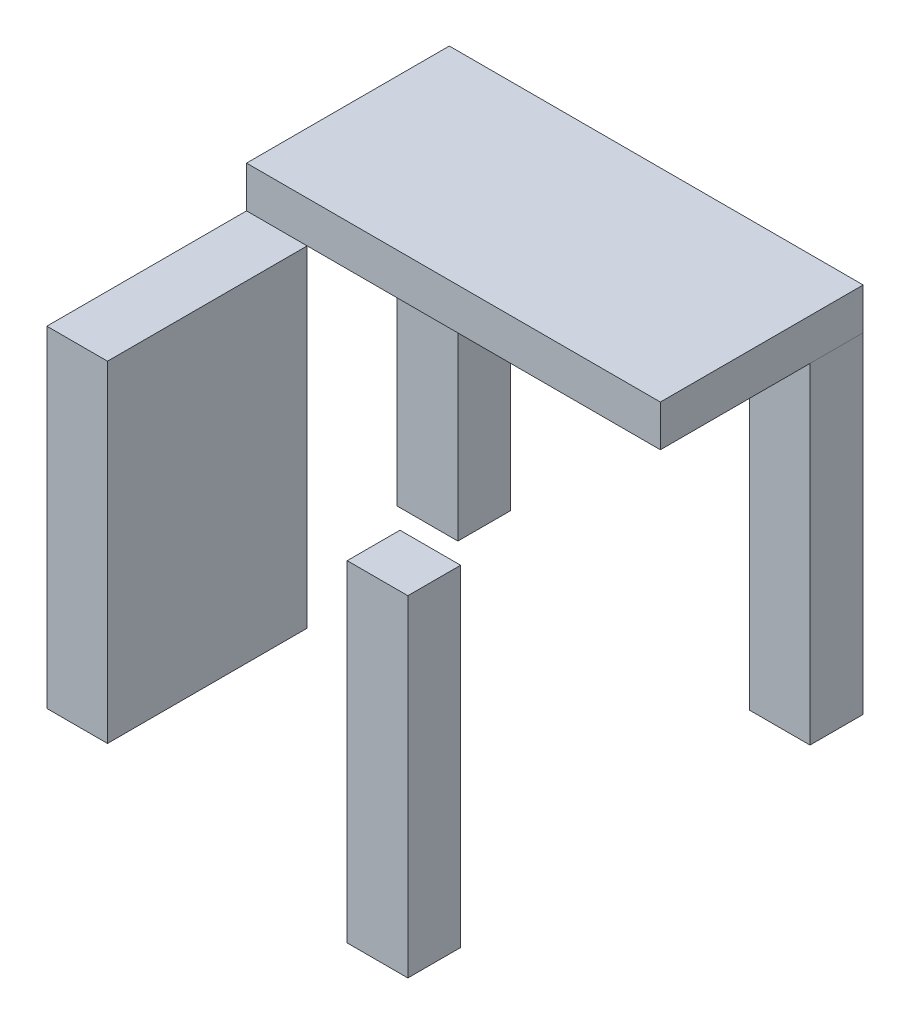
ISO-10303-21;
HEADER;
FILE_DESCRIPTION(('STEP AP214'),'2;1');
FILE_NAME('part.step','',(''),(''),'','','');
FILE_SCHEMA(('AUTOMOTIVE_DESIGN { 1 0 10303 214 1 1 1 1 }'));
ENDSEC;
DATA;
#1=APPLICATION_CONTEXT('core data for automotive mechanical design processes');
#2=APPLICATION_PROTOCOL_DEFINITION('international standard','automotive_design',2000,#1);
#3=PRODUCT_CONTEXT('',#1,'mechanical');
#4=PRODUCT('Part','Part','',(#3));
#5=PRODUCT_RELATED_PRODUCT_CATEGORY('part','',(#4));
#6=PRODUCT_DEFINITION_FORMATION('','',#4);
#7=PRODUCT_DEFINITION_CONTEXT('part definition',#1,'design');
#8=PRODUCT_DEFINITION('design','',#6,#7);
#9=PRODUCT_DEFINITION_SHAPE('','',#8);
#10=(LENGTH_UNIT() NAMED_UNIT(*) SI_UNIT(.MILLI.,.METRE.));
#11=(NAMED_UNIT(*) PLANE_ANGLE_UNIT() SI_UNIT($,.RADIAN.));
#12=(NAMED_UNIT(*) SI_UNIT($,.STERADIAN.) SOLID_ANGLE_UNIT());
#13=UNCERTAINTY_MEASURE_WITH_UNIT(LENGTH_MEASURE(1.E-05),#10,'distance_accuracy_value','');
#14=(GEOMETRIC_REPRESENTATION_CONTEXT(3) GLOBAL_UNCERTAINTY_ASSIGNED_CONTEXT((#13)) GLOBAL_UNIT_ASSIGNED_CONTEXT((#10,
#11,#12)) REPRESENTATION_CONTEXT('',''));
#15=CARTESIAN_POINT('',(0.,0.,0.));
#16=DIRECTION('',(0.,0.,1.));
#17=DIRECTION('',(1.,0.,0.));
#18=AXIS2_PLACEMENT_3D('',#15,#16,#17);
#19=CARTESIAN_POINT('',(85.36181093433,-80.,110.034688240795));
#20=DIRECTION('',(1.,0.,0.));
#21=DIRECTION('',(0.,0.,-1.));
#22=AXIS2_PLACEMENT_3D('',#19,#20,#21);
#23=PLANE('',#22);
#24=DIRECTION('',(0.,0.,-1.));
#25=VECTOR('',#24,1.);
#26=CARTESIAN_POINT('',(85.36181093433,0.,110.034688240795));
#27=LINE('',#26,#25);
#28=CARTESIAN_POINT('',(85.36181093433,0.,110.034688240795));
#29=VERTEX_POINT('',#28);
#30=CARTESIAN_POINT('',(85.36181093433,0.,97.2842820171065));
#31=VERTEX_POINT('',#30);
#32=EDGE_CURVE('E107',#29,#31,#27,.T.);
#33=ORIENTED_EDGE('',*,*,#32,.T.);
#34=DIRECTION('',(0.,1.,0.));
#35=VECTOR('',#34,1.);
#36=CARTESIAN_POINT('',(85.36181093433,-80.,97.2842820171065));
#37=LINE('',#36,#35);
#38=CARTESIAN_POINT('',(85.36181093433,-80.,97.2842820171065));
#39=VERTEX_POINT('',#38);
#40=EDGE_CURVE('E12',#39,#31,#37,.T.);
#41=ORIENTED_EDGE('',*,*,#40,.F.);
#42=DIRECTION('',(0.,0.,-1.));
#43=VECTOR('',#42,1.);
#44=CARTESIAN_POINT('',(85.36181093433,-80.,110.034688240795));
#45=LINE('',#44,#43);
#46=CARTESIAN_POINT('',(85.36181093433,-80.,110.034688240795));
#47=VERTEX_POINT('',#46);
#48=EDGE_CURVE('E95',#47,#39,#45,.T.);
#49=ORIENTED_EDGE('',*,*,#48,.F.);
#50=DIRECTION('',(0.,1.,0.));
#51=VECTOR('',#50,1.);
#52=CARTESIAN_POINT('',(85.36181093433,-80.,110.034688240795));
#53=LINE('',#52,#51);
#54=EDGE_CURVE('E103',#47,#29,#53,.T.);
#55=ORIENTED_EDGE('',*,*,#54,.T.);
#56=EDGE_LOOP('',(#33,#41,#49,#55));
#57=FACE_BOUND('',#56,.T.);
#58=ADVANCED_FACE('F44',(#57),#23,.F.);
#59=CARTESIAN_POINT('',(85.36181093433,-80.,97.2842820171065));
#60=DIRECTION('',(0.,0.,1.));
#61=DIRECTION('',(1.,0.,0.));
#62=AXIS2_PLACEMENT_3D('',#59,#60,#61);
#63=PLANE('',#62);
#64=DIRECTION('',(1.,0.,0.));
#65=VECTOR('',#64,1.);
#66=CARTESIAN_POINT('',(85.36181093433,0.,97.2842820171065));
#67=LINE('',#66,#65);
#68=CARTESIAN_POINT('',(100.019107271016,0.,97.2842820171065));
#69=VERTEX_POINT('',#68);
#70=EDGE_CURVE('E99',#31,#69,#67,.T.);
#71=ORIENTED_EDGE('',*,*,#70,.T.);
#72=DIRECTION('',(0.,1.,0.));
#73=VECTOR('',#72,1.);
#74=CARTESIAN_POINT('',(100.019107271016,-80.,97.2842820171065));
#75=LINE('',#74,#73);
#76=CARTESIAN_POINT('',(100.019107271016,-80.,97.2842820171065));
#77=VERTEX_POINT('',#76);
#78=EDGE_CURVE('E52',#77,#69,#75,.T.);
#79=ORIENTED_EDGE('',*,*,#78,.F.);
#80=DIRECTION('',(1.,0.,0.));
#81=VECTOR('',#80,1.);
#82=CARTESIAN_POINT('',(85.36181093433,-80.,97.2842820171065));
#83=LINE('',#82,#81);
#84=EDGE_CURVE('E90',#39,#77,#83,.T.);
#85=ORIENTED_EDGE('',*,*,#84,.F.);
#86=ORIENTED_EDGE('',*,*,#40,.T.);
#87=EDGE_LOOP('',(#71,#79,#85,#86));
#88=FACE_BOUND('',#87,.T.);
#89=ADVANCED_FACE('F98',(#88),#63,.F.);
#90=CARTESIAN_POINT('',(100.019107271016,-80.,110.034688240795));
#91=DIRECTION('',(-1.,0.,0.));
#92=DIRECTION('',(0.,0.,1.));
#93=AXIS2_PLACEMENT_3D('',#90,#91,#92);
#94=PLANE('',#93);
#95=DIRECTION('',(0.,0.,1.));
#96=VECTOR('',#95,1.);
#97=CARTESIAN_POINT('',(100.019107271016,0.,110.034688240795));
#98=LINE('',#97,#96);
#99=CARTESIAN_POINT('',(100.019107271016,0.,110.034688240795));
#100=VERTEX_POINT('',#99);
#101=EDGE_CURVE('E77',#69,#100,#98,.T.);
#102=ORIENTED_EDGE('',*,*,#101,.T.);
#103=DIRECTION('',(0.,1.,0.));
#104=VECTOR('',#103,1.);
#105=CARTESIAN_POINT('',(100.019107271016,-80.,110.034688240795));
#106=LINE('',#105,#104);
#107=CARTESIAN_POINT('',(100.019107271016,-80.,110.034688240795));
#108=VERTEX_POINT('',#107);
#109=EDGE_CURVE('E100',#108,#100,#106,.T.);
#110=ORIENTED_EDGE('',*,*,#109,.F.);
#111=DIRECTION('',(0.,0.,1.));
#112=VECTOR('',#111,1.);
#113=CARTESIAN_POINT('',(100.019107271016,-80.,110.034688240795));
#114=LINE('',#113,#112);
#115=EDGE_CURVE('E93',#77,#108,#114,.T.);
#116=ORIENTED_EDGE('',*,*,#115,.F.);
#117=ORIENTED_EDGE('',*,*,#78,.T.);
#118=EDGE_LOOP('',(#102,#110,#116,#117));
#119=FACE_BOUND('',#118,.T.);
#120=ADVANCED_FACE('F101',(#119),#94,.F.);
#121=CARTESIAN_POINT('',(85.36181093433,-80.,110.034688240795));
#122=DIRECTION('',(0.,0.,-1.));
#123=DIRECTION('',(-1.,0.,0.));
#124=AXIS2_PLACEMENT_3D('',#121,#122,#123);
#125=PLANE('',#124);
#126=DIRECTION('',(-1.,0.,0.));
#127=VECTOR('',#126,1.);
#128=CARTESIAN_POINT('',(85.36181093433,0.,110.034688240795));
#129=LINE('',#128,#127);
#130=EDGE_CURVE('E83',#100,#29,#129,.T.);
#131=ORIENTED_EDGE('',*,*,#130,.T.);
#132=ORIENTED_EDGE('',*,*,#54,.F.);
#133=DIRECTION('',(-1.,0.,0.));
#134=VECTOR('',#133,1.);
#135=CARTESIAN_POINT('',(85.36181093433,-80.,110.034688240795));
#136=LINE('',#135,#134);
#137=EDGE_CURVE('E60',#108,#47,#136,.T.);
#138=ORIENTED_EDGE('',*,*,#137,.F.);
#139=ORIENTED_EDGE('',*,*,#109,.T.);
#140=EDGE_LOOP('',(#131,#132,#138,#139));
#141=FACE_BOUND('',#140,.T.);
#142=ADVANCED_FACE('F114',(#141),#125,.F.);
#143=CARTESIAN_POINT('',(0.,-80.,0.));
#144=DIRECTION('',(0.,-1.,0.));
#145=DIRECTION('',(0.,0.,-1.));
#146=AXIS2_PLACEMENT_3D('',#143,#144,#145);
#147=PLANE('',#146);
#148=ORIENTED_EDGE('',*,*,#48,.T.);
#149=ORIENTED_EDGE('',*,*,#84,.T.);
#150=ORIENTED_EDGE('',*,*,#115,.T.);
#151=ORIENTED_EDGE('',*,*,#137,.T.);
#152=EDGE_LOOP('',(#148,#149,#150,#151));
#153=FACE_BOUND('',#152,.T.);
#154=ADVANCED_FACE('F91',(#153),#147,.T.);
#155=CARTESIAN_POINT('',(0.,0.,0.));
#156=DIRECTION('',(0.,-1.,0.));
#157=DIRECTION('',(0.,0.,-1.));
#158=AXIS2_PLACEMENT_3D('',#155,#156,#157);
#159=PLANE('',#158);
#160=ORIENTED_EDGE('',*,*,#32,.F.);
#161=ORIENTED_EDGE('',*,*,#130,.F.);
#162=ORIENTED_EDGE('',*,*,#101,.F.);
#163=ORIENTED_EDGE('',*,*,#70,.F.);
#164=EDGE_LOOP('',(#160,#161,#162,#163));
#165=FACE_BOUND('',#164,.T.);
#166=ADVANCED_FACE('F117',(#165),#159,.F.);
#167=CLOSED_SHELL('',(#58,#89,#120,#142,#154,#166));
#168=MANIFOLD_SOLID_BREP('B2',#167);
#169=CARTESIAN_POINT('',(0.,-80.,49.));
#170=DIRECTION('',(1.,0.,0.));
#171=DIRECTION('',(0.,0.,-1.));
#172=AXIS2_PLACEMENT_3D('',#169,#170,#171);
#173=PLANE('',#172);
#174=DIRECTION('',(0.,0.,-1.));
#175=VECTOR('',#174,1.);
#176=CARTESIAN_POINT('',(0.,0.,49.));
#177=LINE('',#176,#175);
#178=CARTESIAN_POINT('',(0.,0.,97.2495937763114));
#179=VERTEX_POINT('',#178);
#180=CARTESIAN_POINT('',(0.,0.,49.));
#181=VERTEX_POINT('',#180);
#182=EDGE_CURVE('E240',#179,#181,#177,.T.);
#183=ORIENTED_EDGE('',*,*,#182,.T.);
#184=DIRECTION('',(0.,1.,0.));
#185=VECTOR('',#184,1.);
#186=CARTESIAN_POINT('',(0.,-80.,49.));
#187=LINE('',#186,#185);
#188=CARTESIAN_POINT('',(0.,-80.,49.));
#189=VERTEX_POINT('',#188);
#190=EDGE_CURVE('E42',#189,#181,#187,.T.);
#191=ORIENTED_EDGE('',*,*,#190,.F.);
#192=DIRECTION('',(0.,0.,-1.));
#193=VECTOR('',#192,1.);
#194=CARTESIAN_POINT('',(0.,-80.,49.));
#195=LINE('',#194,#193);
#196=CARTESIAN_POINT('',(0.,-80.,97.2495937763114));
#197=VERTEX_POINT('',#196);
#198=EDGE_CURVE('E228',#197,#189,#195,.T.);
#199=ORIENTED_EDGE('',*,*,#198,.F.);
#200=DIRECTION('',(0.,1.,0.));
#201=VECTOR('',#200,1.);
#202=CARTESIAN_POINT('',(0.,-80.,97.2495937763114));
#203=LINE('',#202,#201);
#204=EDGE_CURVE('E236',#197,#179,#203,.T.);
#205=ORIENTED_EDGE('',*,*,#204,.T.);
#206=EDGE_LOOP('',(#183,#191,#199,#205));
#207=FACE_BOUND('',#206,.T.);
#208=ADVANCED_FACE('F177',(#207),#173,.F.);
#209=CARTESIAN_POINT('',(0.,-80.,49.));
#210=DIRECTION('',(0.,0.,1.));
#211=DIRECTION('',(1.,0.,0.));
#212=AXIS2_PLACEMENT_3D('',#209,#210,#211);
#213=PLANE('',#212);
#214=DIRECTION('',(1.,0.,0.));
#215=VECTOR('',#214,1.);
#216=CARTESIAN_POINT('',(0.,0.,49.));
#217=LINE('',#216,#215);
#218=CARTESIAN_POINT('',(14.6572963366857,0.,49.));
#219=VERTEX_POINT('',#218);
#220=EDGE_CURVE('E232',#181,#219,#217,.T.);
#221=ORIENTED_EDGE('',*,*,#220,.T.);
#222=DIRECTION('',(0.,1.,0.));
#223=VECTOR('',#222,1.);
#224=CARTESIAN_POINT('',(14.6572963366857,-80.,49.));
#225=LINE('',#224,#223);
#226=CARTESIAN_POINT('',(14.6572963366857,-80.,49.));
#227=VERTEX_POINT('',#226);
#228=EDGE_CURVE('E185',#227,#219,#225,.T.);
#229=ORIENTED_EDGE('',*,*,#228,.F.);
#230=DIRECTION('',(1.,0.,0.));
#231=VECTOR('',#230,1.);
#232=CARTESIAN_POINT('',(0.,-80.,49.));
#233=LINE('',#232,#231);
#234=EDGE_CURVE('E223',#189,#227,#233,.T.);
#235=ORIENTED_EDGE('',*,*,#234,.F.);
#236=ORIENTED_EDGE('',*,*,#190,.T.);
#237=EDGE_LOOP('',(#221,#229,#235,#236));
#238=FACE_BOUND('',#237,.T.);
#239=ADVANCED_FACE('F231',(#238),#213,.F.);
#240=CARTESIAN_POINT('',(14.6572963366857,-80.,49.));
#241=DIRECTION('',(-1.,0.,0.));
#242=DIRECTION('',(0.,0.,1.));
#243=AXIS2_PLACEMENT_3D('',#240,#241,#242);
#244=PLANE('',#243);
#245=DIRECTION('',(0.,0.,1.));
#246=VECTOR('',#245,1.);
#247=CARTESIAN_POINT('',(14.6572963366857,0.,49.));
#248=LINE('',#247,#246);
#249=CARTESIAN_POINT('',(14.6572963366857,0.,97.2495937763114));
#250=VERTEX_POINT('',#249);
#251=EDGE_CURVE('E210',#219,#250,#248,.T.);
#252=ORIENTED_EDGE('',*,*,#251,.T.);
#253=DIRECTION('',(0.,1.,0.));
#254=VECTOR('',#253,1.);
#255=CARTESIAN_POINT('',(14.6572963366857,-80.,97.2495937763114));
#256=LINE('',#255,#254);
#257=CARTESIAN_POINT('',(14.6572963366857,-80.,97.2495937763114));
#258=VERTEX_POINT('',#257);
#259=EDGE_CURVE('E233',#258,#250,#256,.T.);
#260=ORIENTED_EDGE('',*,*,#259,.F.);
#261=DIRECTION('',(0.,0.,1.));
#262=VECTOR('',#261,1.);
#263=CARTESIAN_POINT('',(14.6572963366857,-80.,49.));
#264=LINE('',#263,#262);
#265=EDGE_CURVE('E226',#227,#258,#264,.T.);
#266=ORIENTED_EDGE('',*,*,#265,.F.);
#267=ORIENTED_EDGE('',*,*,#228,.T.);
#268=EDGE_LOOP('',(#252,#260,#266,#267));
#269=FACE_BOUND('',#268,.T.);
#270=ADVANCED_FACE('F234',(#269),#244,.F.);
#271=CARTESIAN_POINT('',(0.,-80.,97.2495937763114));
#272=DIRECTION('',(0.,0.,-1.));
#273=DIRECTION('',(-1.,0.,0.));
#274=AXIS2_PLACEMENT_3D('',#271,#272,#273);
#275=PLANE('',#274);
#276=DIRECTION('',(-1.,0.,0.));
#277=VECTOR('',#276,1.);
#278=CARTESIAN_POINT('',(0.,0.,97.2495937763114));
#279=LINE('',#278,#277);
#280=EDGE_CURVE('E216',#250,#179,#279,.T.);
#281=ORIENTED_EDGE('',*,*,#280,.T.);
#282=ORIENTED_EDGE('',*,*,#204,.F.);
#283=DIRECTION('',(-1.,0.,0.));
#284=VECTOR('',#283,1.);
#285=CARTESIAN_POINT('',(0.,-80.,97.2495937763114));
#286=LINE('',#285,#284);
#287=EDGE_CURVE('E193',#258,#197,#286,.T.);
#288=ORIENTED_EDGE('',*,*,#287,.F.);
#289=ORIENTED_EDGE('',*,*,#259,.T.);
#290=EDGE_LOOP('',(#281,#282,#288,#289));
#291=FACE_BOUND('',#290,.T.);
#292=ADVANCED_FACE('F247',(#291),#275,.F.);
#293=CARTESIAN_POINT('',(0.,-80.,0.));
#294=DIRECTION('',(0.,1.,0.));
#295=DIRECTION('',(0.,0.,1.));
#296=AXIS2_PLACEMENT_3D('',#293,#294,#295);
#297=PLANE('',#296);
#298=ORIENTED_EDGE('',*,*,#198,.T.);
#299=ORIENTED_EDGE('',*,*,#234,.T.);
#300=ORIENTED_EDGE('',*,*,#265,.T.);
#301=ORIENTED_EDGE('',*,*,#287,.T.);
#302=EDGE_LOOP('',(#298,#299,#300,#301));
#303=FACE_BOUND('',#302,.T.);
#304=ADVANCED_FACE('F224',(#303),#297,.F.);
#305=CARTESIAN_POINT('',(0.,0.,0.));
#306=DIRECTION('',(0.,1.,0.));
#307=DIRECTION('',(0.,0.,1.));
#308=AXIS2_PLACEMENT_3D('',#305,#306,#307);
#309=PLANE('',#308);
#310=ORIENTED_EDGE('',*,*,#182,.F.);
#311=ORIENTED_EDGE('',*,*,#280,.F.);
#312=ORIENTED_EDGE('',*,*,#251,.F.);
#313=ORIENTED_EDGE('',*,*,#220,.F.);
#314=EDGE_LOOP('',(#310,#311,#312,#313));
#315=FACE_BOUND('',#314,.T.);
#316=ADVANCED_FACE('F250',(#315),#309,.T.);
#317=CLOSED_SHELL('',(#208,#239,#270,#292,#304,#316));
#318=MANIFOLD_SOLID_BREP('B6',#317);
#319=CARTESIAN_POINT('',(0.,0.,49.));
#320=DIRECTION('',(0.,1.,0.));
#321=DIRECTION('',(0.,0.,1.));
#322=AXIS2_PLACEMENT_3D('',#319,#320,#321);
#323=PLANE('',#322);
#324=DIRECTION('',(0.,0.,-1.));
#325=VECTOR('',#324,1.);
#326=CARTESIAN_POINT('',(85.2148558255428,0.,12.7157179828936));
#327=LINE('',#326,#325);
#328=CARTESIAN_POINT('',(85.2148558255428,0.,12.7157179828936));
#329=VERTEX_POINT('',#328);
#330=CARTESIAN_POINT('',(85.2148558255428,0.,0.));
#331=VERTEX_POINT('',#330);
#332=EDGE_CURVE('E318',#329,#331,#327,.T.);
#333=ORIENTED_EDGE('',*,*,#332,.F.);
#334=DIRECTION('',(-1.,0.,0.));
#335=VECTOR('',#334,1.);
#336=CARTESIAN_POINT('',(85.2148558255428,0.,12.7157179828936));
#337=LINE('',#336,#335);
#338=CARTESIAN_POINT('',(99.8721521622285,0.,12.7157179828936));
#339=VERTEX_POINT('',#338);
#340=EDGE_CURVE('E322',#339,#329,#337,.T.);
#341=ORIENTED_EDGE('',*,*,#340,.F.);
#342=DIRECTION('',(0.,0.,1.));
#343=VECTOR('',#342,1.);
#344=CARTESIAN_POINT('',(99.8721521622285,0.,12.7157179828936));
#345=LINE('',#344,#343);
#346=CARTESIAN_POINT('',(99.8721521622285,0.,0.));
#347=VERTEX_POINT('',#346);
#348=EDGE_CURVE('E647',#347,#339,#345,.T.);
#349=ORIENTED_EDGE('',*,*,#348,.F.);
#350=DIRECTION('',(1.,0.,0.));
#351=VECTOR('',#350,1.);
#352=CARTESIAN_POINT('',(0.,0.,0.));
#353=LINE('',#352,#351);
#354=CARTESIAN_POINT('',(100.,0.,0.));
#355=VERTEX_POINT('',#354);
#356=EDGE_CURVE('E478',#347,#355,#353,.T.);
#357=ORIENTED_EDGE('',*,*,#356,.T.);
#358=DIRECTION('',(0.,0.,-1.));
#359=VECTOR('',#358,1.);
#360=CARTESIAN_POINT('',(100.,0.,49.));
#361=LINE('',#360,#359);
#362=CARTESIAN_POINT('',(100.,0.,49.));
#363=VERTEX_POINT('',#362);
#364=EDGE_CURVE('E490',#363,#355,#361,.T.);
#365=ORIENTED_EDGE('',*,*,#364,.F.);
#366=DIRECTION('',(1.,0.,0.));
#367=VECTOR('',#366,1.);
#368=CARTESIAN_POINT('',(0.,0.,49.));
#369=LINE('',#368,#367);
#370=CARTESIAN_POINT('',(0.,0.,49.));
#371=VERTEX_POINT('',#370);
#372=EDGE_CURVE('E468',#371,#363,#369,.T.);
#373=ORIENTED_EDGE('',*,*,#372,.F.);
#374=DIRECTION('',(0.,0.,-1.));
#375=VECTOR('',#374,1.);
#376=CARTESIAN_POINT('',(0.,0.,49.));
#377=LINE('',#376,#375);
#378=CARTESIAN_POINT('',(0.,0.,12.5687628741064));
#379=VERTEX_POINT('',#378);
#380=EDGE_CURVE('E305',#371,#379,#377,.T.);
#381=ORIENTED_EDGE('',*,*,#380,.T.);
#382=DIRECTION('',(-1.,0.,0.));
#383=VECTOR('',#382,1.);
#384=CARTESIAN_POINT('',(-0.0191072710157194,0.,12.5687628741064));
#385=LINE('',#384,#383);
#386=CARTESIAN_POINT('',(14.63818906567,0.,12.5687628741064));
#387=VERTEX_POINT('',#386);
#388=EDGE_CURVE('E441',#387,#379,#385,.T.);
#389=ORIENTED_EDGE('',*,*,#388,.F.);
#390=DIRECTION('',(0.,0.,1.));
#391=VECTOR('',#390,1.);
#392=CARTESIAN_POINT('',(14.63818906567,0.,12.5687628741064));
#393=LINE('',#392,#391);
#394=CARTESIAN_POINT('',(14.63818906567,0.,0.));
#395=VERTEX_POINT('',#394);
#396=EDGE_CURVE('E175',#395,#387,#393,.T.);
#397=ORIENTED_EDGE('',*,*,#396,.F.);
#398=EDGE_CURVE('E483',#395,#331,#353,.T.);
#399=ORIENTED_EDGE('',*,*,#398,.T.);
#400=EDGE_LOOP('',(#333,#341,#349,#357,#365,#373,#381,#389,#397,#399));
#401=FACE_BOUND('',#400,.T.);
#402=ADVANCED_FACE('F301',(#401),#323,.F.);
#403=CARTESIAN_POINT('',(0.,0.,49.));
#404=DIRECTION('',(1.,0.,0.));
#405=DIRECTION('',(0.,0.,-1.));
#406=AXIS2_PLACEMENT_3D('',#403,#404,#405);
#407=PLANE('',#406);
#408=DIRECTION('',(0.,-1.,0.));
#409=VECTOR('',#408,1.);
#410=CARTESIAN_POINT('',(0.,0.,0.));
#411=LINE('',#410,#409);
#412=CARTESIAN_POINT('',(0.,10.,0.));
#413=VERTEX_POINT('',#412);
#414=CARTESIAN_POINT('',(0.,0.,0.));
#415=VERTEX_POINT('',#414);
#416=EDGE_CURVE('E464',#413,#415,#411,.T.);
#417=ORIENTED_EDGE('',*,*,#416,.T.);
#418=EDGE_CURVE('E492',#379,#415,#377,.T.);
#419=ORIENTED_EDGE('',*,*,#418,.F.);
#420=ORIENTED_EDGE('',*,*,#380,.F.);
#421=DIRECTION('',(0.,-1.,0.));
#422=VECTOR('',#421,1.);
#423=CARTESIAN_POINT('',(0.,0.,49.));
#424=LINE('',#423,#422);
#425=CARTESIAN_POINT('',(0.,10.,49.));
#426=VERTEX_POINT('',#425);
#427=EDGE_CURVE('E465',#426,#371,#424,.T.);
#428=ORIENTED_EDGE('',*,*,#427,.F.);
#429=DIRECTION('',(0.,0.,-1.));
#430=VECTOR('',#429,1.);
#431=CARTESIAN_POINT('',(0.,10.,49.));
#432=LINE('',#431,#430);
#433=EDGE_CURVE('E475',#426,#413,#432,.T.);
#434=ORIENTED_EDGE('',*,*,#433,.T.);
#435=EDGE_LOOP('',(#417,#419,#420,#428,#434));
#436=FACE_BOUND('',#435,.T.);
#437=ADVANCED_FACE('F303',(#436),#407,.F.);
#438=CARTESIAN_POINT('',(100.,0.,49.));
#439=DIRECTION('',(-1.,0.,0.));
#440=DIRECTION('',(0.,0.,1.));
#441=AXIS2_PLACEMENT_3D('',#438,#439,#440);
#442=PLANE('',#441);
#443=DIRECTION('',(0.,1.,0.));
#444=VECTOR('',#443,1.);
#445=CARTESIAN_POINT('',(100.,0.,0.));
#446=LINE('',#445,#444);
#447=CARTESIAN_POINT('',(100.,10.,0.));
#448=VERTEX_POINT('',#447);
#449=EDGE_CURVE('E482',#355,#448,#446,.T.);
#450=ORIENTED_EDGE('',*,*,#449,.T.);
#451=DIRECTION('',(0.,0.,-1.));
#452=VECTOR('',#451,1.);
#453=CARTESIAN_POINT('',(100.,10.,49.));
#454=LINE('',#453,#452);
#455=CARTESIAN_POINT('',(100.,10.,49.));
#456=VERTEX_POINT('',#455);
#457=EDGE_CURVE('E488',#456,#448,#454,.T.);
#458=ORIENTED_EDGE('',*,*,#457,.F.);
#459=DIRECTION('',(0.,1.,0.));
#460=VECTOR('',#459,1.);
#461=CARTESIAN_POINT('',(100.,0.,49.));
#462=LINE('',#461,#460);
#463=EDGE_CURVE('E471',#363,#456,#462,.T.);
#464=ORIENTED_EDGE('',*,*,#463,.F.);
#465=ORIENTED_EDGE('',*,*,#364,.T.);
#466=EDGE_LOOP('',(#450,#458,#464,#465));
#467=FACE_BOUND('',#466,.T.);
#468=ADVANCED_FACE('F543',(#467),#442,.F.);
#469=CARTESIAN_POINT('',(0.,10.,49.));
#470=DIRECTION('',(0.,-1.,0.));
#471=DIRECTION('',(0.,0.,-1.));
#472=AXIS2_PLACEMENT_3D('',#469,#470,#471);
#473=PLANE('',#472);
#474=DIRECTION('',(-1.,0.,0.));
#475=VECTOR('',#474,1.);
#476=CARTESIAN_POINT('',(0.,10.,0.));
#477=LINE('',#476,#475);
#478=EDGE_CURVE('E469',#448,#413,#477,.T.);
#479=ORIENTED_EDGE('',*,*,#478,.T.);
#480=ORIENTED_EDGE('',*,*,#433,.F.);
#481=DIRECTION('',(-1.,0.,0.));
#482=VECTOR('',#481,1.);
#483=CARTESIAN_POINT('',(0.,10.,49.));
#484=LINE('',#483,#482);
#485=EDGE_CURVE('E473',#456,#426,#484,.T.);
#486=ORIENTED_EDGE('',*,*,#485,.F.);
#487=ORIENTED_EDGE('',*,*,#457,.T.);
#488=EDGE_LOOP('',(#479,#480,#486,#487));
#489=FACE_BOUND('',#488,.T.);
#490=ADVANCED_FACE('F547',(#489),#473,.F.);
#491=CARTESIAN_POINT('',(0.,0.,49.));
#492=DIRECTION('',(0.,0.,-1.));
#493=DIRECTION('',(-1.,0.,0.));
#494=AXIS2_PLACEMENT_3D('',#491,#492,#493);
#495=PLANE('',#494);
#496=ORIENTED_EDGE('',*,*,#427,.T.);
#497=ORIENTED_EDGE('',*,*,#372,.T.);
#498=ORIENTED_EDGE('',*,*,#463,.T.);
#499=ORIENTED_EDGE('',*,*,#485,.T.);
#500=EDGE_LOOP('',(#496,#497,#498,#499));
#501=FACE_BOUND('',#500,.T.);
#502=ADVANCED_FACE('F550',(#501),#495,.F.);
#503=CARTESIAN_POINT('',(0.,0.,0.));
#504=DIRECTION('',(0.,0.,-1.));
#505=DIRECTION('',(-1.,0.,0.));
#506=AXIS2_PLACEMENT_3D('',#503,#504,#505);
#507=PLANE('',#506);
#508=ORIENTED_EDGE('',*,*,#416,.F.);
#509=ORIENTED_EDGE('',*,*,#478,.F.);
#510=ORIENTED_EDGE('',*,*,#449,.F.);
#511=ORIENTED_EDGE('',*,*,#356,.F.);
#512=EDGE_CURVE('E520',#331,#347,#353,.T.);
#513=ORIENTED_EDGE('',*,*,#512,.F.);
#514=ORIENTED_EDGE('',*,*,#398,.F.);
#515=EDGE_CURVE('E479',#415,#395,#353,.T.);
#516=ORIENTED_EDGE('',*,*,#515,.F.);
#517=EDGE_LOOP('',(#508,#509,#510,#511,#513,#514,#516));
#518=FACE_BOUND('',#517,.T.);
#519=ADVANCED_FACE('F518',(#518),#507,.T.);
#520=CARTESIAN_POINT('',(0.,0.,0.));
#521=DIRECTION('',(0.,-1.,0.));
#522=DIRECTION('',(0.,0.,-1.));
#523=AXIS2_PLACEMENT_3D('',#520,#521,#522);
#524=PLANE('',#523);
#525=ORIENTED_EDGE('',*,*,#418,.T.);
#526=ORIENTED_EDGE('',*,*,#515,.T.);
#527=CARTESIAN_POINT('',(14.63818906567,0.,-0.181643349582247));
#528=VERTEX_POINT('',#527);
#529=EDGE_CURVE('E311',#528,#395,#393,.T.);
#530=ORIENTED_EDGE('',*,*,#529,.F.);
#531=DIRECTION('',(1.,0.,0.));
#532=VECTOR('',#531,1.);
#533=CARTESIAN_POINT('',(-0.0191072710157177,0.,-0.181643349582247));
#534=LINE('',#533,#532);
#535=CARTESIAN_POINT('',(-0.0191072710157177,0.,-0.181643349582247));
#536=VERTEX_POINT('',#535);
#537=EDGE_CURVE('E431',#536,#528,#534,.T.);
#538=ORIENTED_EDGE('',*,*,#537,.F.);
#539=DIRECTION('',(0.,0.,-1.));
#540=VECTOR('',#539,1.);
#541=CARTESIAN_POINT('',(-0.0191072710157194,0.,12.5687628741064));
#542=LINE('',#541,#540);
#543=CARTESIAN_POINT('',(-0.0191072710157194,0.,12.5687628741064));
#544=VERTEX_POINT('',#543);
#545=EDGE_CURVE('E428',#544,#536,#542,.T.);
#546=ORIENTED_EDGE('',*,*,#545,.F.);
#547=EDGE_CURVE('E450',#379,#544,#385,.T.);
#548=ORIENTED_EDGE('',*,*,#547,.F.);
#549=EDGE_LOOP('',(#525,#526,#530,#538,#546,#548));
#550=FACE_BOUND('',#549,.T.);
#551=ADVANCED_FACE('F505',(#550),#524,.F.);
#552=CARTESIAN_POINT('',(-0.0191072710157194,-80.,12.5687628741064));
#553=DIRECTION('',(1.,0.,0.));
#554=DIRECTION('',(0.,0.,-1.));
#555=AXIS2_PLACEMENT_3D('',#552,#553,#554);
#556=PLANE('',#555);
#557=ORIENTED_EDGE('',*,*,#545,.T.);
#558=DIRECTION('',(0.,1.,0.));
#559=VECTOR('',#558,1.);
#560=CARTESIAN_POINT('',(-0.0191072710157177,-80.,-0.181643349582247));
#561=LINE('',#560,#559);
#562=CARTESIAN_POINT('',(-0.0191072710157177,-80.,-0.181643349582247));
#563=VERTEX_POINT('',#562);
#564=EDGE_CURVE('E461',#563,#536,#561,.T.);
#565=ORIENTED_EDGE('',*,*,#564,.F.);
#566=DIRECTION('',(0.,0.,-1.));
#567=VECTOR('',#566,1.);
#568=CARTESIAN_POINT('',(-0.0191072710157194,-80.,12.5687628741064));
#569=LINE('',#568,#567);
#570=CARTESIAN_POINT('',(-0.0191072710157194,-80.,12.5687628741064));
#571=VERTEX_POINT('',#570);
#572=EDGE_CURVE('E437',#571,#563,#569,.T.);
#573=ORIENTED_EDGE('',*,*,#572,.F.);
#574=DIRECTION('',(0.,1.,0.));
#575=VECTOR('',#574,1.);
#576=CARTESIAN_POINT('',(-0.0191072710157194,-80.,12.5687628741064));
#577=LINE('',#576,#575);
#578=EDGE_CURVE('E446',#571,#544,#577,.T.);
#579=ORIENTED_EDGE('',*,*,#578,.T.);
#580=EDGE_LOOP('',(#557,#565,#573,#579));
#581=FACE_BOUND('',#580,.T.);
#582=ADVANCED_FACE('F527',(#581),#556,.F.);
#583=CARTESIAN_POINT('',(-0.0191072710157177,-80.,-0.181643349582247));
#584=DIRECTION('',(0.,0.,1.));
#585=DIRECTION('',(1.,0.,0.));
#586=AXIS2_PLACEMENT_3D('',#583,#584,#585);
#587=PLANE('',#586);
#588=ORIENTED_EDGE('',*,*,#537,.T.);
#589=DIRECTION('',(0.,1.,0.));
#590=VECTOR('',#589,1.);
#591=CARTESIAN_POINT('',(14.63818906567,-80.,-0.181643349582247));
#592=LINE('',#591,#590);
#593=CARTESIAN_POINT('',(14.63818906567,-80.,-0.181643349582247));
#594=VERTEX_POINT('',#593);
#595=EDGE_CURVE('E458',#594,#528,#592,.T.);
#596=ORIENTED_EDGE('',*,*,#595,.F.);
#597=DIRECTION('',(1.,0.,0.));
#598=VECTOR('',#597,1.);
#599=CARTESIAN_POINT('',(-0.0191072710157177,-80.,-0.181643349582247));
#600=LINE('',#599,#598);
#601=EDGE_CURVE('E440',#563,#594,#600,.T.);
#602=ORIENTED_EDGE('',*,*,#601,.F.);
#603=ORIENTED_EDGE('',*,*,#564,.T.);
#604=EDGE_LOOP('',(#588,#596,#602,#603));
#605=FACE_BOUND('',#604,.T.);
#606=ADVANCED_FACE('F524',(#605),#587,.F.);
#607=CARTESIAN_POINT('',(14.63818906567,-80.,12.5687628741064));
#608=DIRECTION('',(-1.,0.,0.));
#609=DIRECTION('',(0.,0.,1.));
#610=AXIS2_PLACEMENT_3D('',#607,#608,#609);
#611=PLANE('',#610);
#612=ORIENTED_EDGE('',*,*,#529,.T.);
#613=ORIENTED_EDGE('',*,*,#396,.T.);
#614=DIRECTION('',(0.,1.,0.));
#615=VECTOR('',#614,1.);
#616=CARTESIAN_POINT('',(14.63818906567,-80.,12.5687628741064));
#617=LINE('',#616,#615);
#618=CARTESIAN_POINT('',(14.63818906567,-80.,12.5687628741064));
#619=VERTEX_POINT('',#618);
#620=EDGE_CURVE('E455',#619,#387,#617,.T.);
#621=ORIENTED_EDGE('',*,*,#620,.F.);
#622=DIRECTION('',(0.,0.,1.));
#623=VECTOR('',#622,1.);
#624=CARTESIAN_POINT('',(14.63818906567,-80.,12.5687628741064));
#625=LINE('',#624,#623);
#626=EDGE_CURVE('E443',#594,#619,#625,.T.);
#627=ORIENTED_EDGE('',*,*,#626,.F.);
#628=ORIENTED_EDGE('',*,*,#595,.T.);
#629=EDGE_LOOP('',(#612,#613,#621,#627,#628));
#630=FACE_BOUND('',#629,.T.);
#631=ADVANCED_FACE('F513',(#630),#611,.F.);
#632=CARTESIAN_POINT('',(-0.0191072710157194,-80.,12.5687628741064));
#633=DIRECTION('',(0.,0.,-1.));
#634=DIRECTION('',(-1.,0.,0.));
#635=AXIS2_PLACEMENT_3D('',#632,#633,#634);
#636=PLANE('',#635);
#637=ORIENTED_EDGE('',*,*,#388,.T.);
#638=ORIENTED_EDGE('',*,*,#547,.T.);
#639=ORIENTED_EDGE('',*,*,#578,.F.);
#640=DIRECTION('',(-1.,0.,0.));
#641=VECTOR('',#640,1.);
#642=CARTESIAN_POINT('',(-0.0191072710157194,-80.,12.5687628741064));
#643=LINE('',#642,#641);
#644=EDGE_CURVE('E445',#619,#571,#643,.T.);
#645=ORIENTED_EDGE('',*,*,#644,.F.);
#646=ORIENTED_EDGE('',*,*,#620,.T.);
#647=EDGE_LOOP('',(#637,#638,#639,#645,#646));
#648=FACE_BOUND('',#647,.T.);
#649=ADVANCED_FACE('F508',(#648),#636,.F.);
#650=CARTESIAN_POINT('',(0.,-80.,0.));
#651=DIRECTION('',(0.,-1.,0.));
#652=DIRECTION('',(0.,0.,-1.));
#653=AXIS2_PLACEMENT_3D('',#650,#651,#652);
#654=PLANE('',#653);
#655=ORIENTED_EDGE('',*,*,#572,.T.);
#656=ORIENTED_EDGE('',*,*,#601,.T.);
#657=ORIENTED_EDGE('',*,*,#626,.T.);
#658=ORIENTED_EDGE('',*,*,#644,.T.);
#659=EDGE_LOOP('',(#655,#656,#657,#658));
#660=FACE_BOUND('',#659,.T.);
#661=ADVANCED_FACE('F529',(#660),#654,.T.);
#662=CARTESIAN_POINT('',(85.2148558255428,-80.,12.7157179828936));
#663=DIRECTION('',(1.,0.,0.));
#664=DIRECTION('',(0.,0.,-1.));
#665=AXIS2_PLACEMENT_3D('',#662,#663,#664);
#666=PLANE('',#665);
#667=ORIENTED_EDGE('',*,*,#332,.T.);
#668=CARTESIAN_POINT('',(85.2148558255428,0.,-0.0346882407950694));
#669=VERTEX_POINT('',#668);
#670=EDGE_CURVE('E426',#331,#669,#327,.T.);
#671=ORIENTED_EDGE('',*,*,#670,.T.);
#672=DIRECTION('',(0.,1.,0.));
#673=VECTOR('',#672,1.);
#674=CARTESIAN_POINT('',(85.2148558255428,-80.,-0.0346882407950694));
#675=LINE('',#674,#673);
#676=CARTESIAN_POINT('',(85.2148558255428,-80.,-0.0346882407950694));
#677=VERTEX_POINT('',#676);
#678=EDGE_CURVE('E408',#677,#669,#675,.T.);
#679=ORIENTED_EDGE('',*,*,#678,.F.);
#680=DIRECTION('',(0.,0.,-1.));
#681=VECTOR('',#680,1.);
#682=CARTESIAN_POINT('',(85.2148558255428,-80.,12.7157179828936));
#683=LINE('',#682,#681);
#684=CARTESIAN_POINT('',(85.2148558255428,-80.,12.7157179828936));
#685=VERTEX_POINT('',#684);
#686=EDGE_CURVE('E414',#685,#677,#683,.T.);
#687=ORIENTED_EDGE('',*,*,#686,.F.);
#688=DIRECTION('',(0.,1.,0.));
#689=VECTOR('',#688,1.);
#690=CARTESIAN_POINT('',(85.2148558255428,-80.,12.7157179828936));
#691=LINE('',#690,#689);
#692=EDGE_CURVE('E655',#685,#329,#691,.T.);
#693=ORIENTED_EDGE('',*,*,#692,.T.);
#694=EDGE_LOOP('',(#667,#671,#679,#687,#693));
#695=FACE_BOUND('',#694,.T.);
#696=ADVANCED_FACE('F424',(#695),#666,.F.);
#697=CARTESIAN_POINT('',(85.2148558255428,-80.,-0.0346882407950694));
#698=DIRECTION('',(0.,0.,1.));
#699=DIRECTION('',(1.,0.,0.));
#700=AXIS2_PLACEMENT_3D('',#697,#698,#699);
#701=PLANE('',#700);
#702=DIRECTION('',(1.,0.,0.));
#703=VECTOR('',#702,1.);
#704=CARTESIAN_POINT('',(85.2148558255428,0.,-0.0346882407950694));
#705=LINE('',#704,#703);
#706=CARTESIAN_POINT('',(99.8721521622285,0.,-0.0346882407950694));
#707=VERTEX_POINT('',#706);
#708=EDGE_CURVE('E651',#669,#707,#705,.T.);
#709=ORIENTED_EDGE('',*,*,#708,.T.);
#710=DIRECTION('',(0.,1.,0.));
#711=VECTOR('',#710,1.);
#712=CARTESIAN_POINT('',(99.8721521622285,-80.,-0.0346882407950694));
#713=LINE('',#712,#711);
#714=CARTESIAN_POINT('',(99.8721521622285,-80.,-0.0346882407950694));
#715=VERTEX_POINT('',#714);
#716=EDGE_CURVE('E410',#715,#707,#713,.T.);
#717=ORIENTED_EDGE('',*,*,#716,.F.);
#718=DIRECTION('',(1.,0.,0.));
#719=VECTOR('',#718,1.);
#720=CARTESIAN_POINT('',(85.2148558255428,-80.,-0.0346882407950694));
#721=LINE('',#720,#719);
#722=EDGE_CURVE('E404',#677,#715,#721,.T.);
#723=ORIENTED_EDGE('',*,*,#722,.F.);
#724=ORIENTED_EDGE('',*,*,#678,.T.);
#725=EDGE_LOOP('',(#709,#717,#723,#724));
#726=FACE_BOUND('',#725,.T.);
#727=ADVANCED_FACE('F406',(#726),#701,.F.);
#728=CARTESIAN_POINT('',(99.8721521622285,-80.,12.7157179828936));
#729=DIRECTION('',(-1.,0.,0.));
#730=DIRECTION('',(0.,0.,1.));
#731=AXIS2_PLACEMENT_3D('',#728,#729,#730);
#732=PLANE('',#731);
#733=EDGE_CURVE('E645',#707,#347,#345,.T.);
#734=ORIENTED_EDGE('',*,*,#733,.T.);
#735=ORIENTED_EDGE('',*,*,#348,.T.);
#736=DIRECTION('',(0.,1.,0.));
#737=VECTOR('',#736,1.);
#738=CARTESIAN_POINT('',(99.8721521622285,-80.,12.7157179828936));
#739=LINE('',#738,#737);
#740=CARTESIAN_POINT('',(99.8721521622285,-80.,12.7157179828936));
#741=VERTEX_POINT('',#740);
#742=EDGE_CURVE('E433',#741,#339,#739,.T.);
#743=ORIENTED_EDGE('',*,*,#742,.F.);
#744=DIRECTION('',(0.,0.,1.));
#745=VECTOR('',#744,1.);
#746=CARTESIAN_POINT('',(99.8721521622285,-80.,12.7157179828936));
#747=LINE('',#746,#745);
#748=EDGE_CURVE('E413',#715,#741,#747,.T.);
#749=ORIENTED_EDGE('',*,*,#748,.F.);
#750=ORIENTED_EDGE('',*,*,#716,.T.);
#751=EDGE_LOOP('',(#734,#735,#743,#749,#750));
#752=FACE_BOUND('',#751,.T.);
#753=ADVANCED_FACE('F602',(#752),#732,.F.);
#754=CARTESIAN_POINT('',(85.2148558255428,-80.,12.7157179828936));
#755=DIRECTION('',(0.,0.,-1.));
#756=DIRECTION('',(-1.,0.,0.));
#757=AXIS2_PLACEMENT_3D('',#754,#755,#756);
#758=PLANE('',#757);
#759=ORIENTED_EDGE('',*,*,#340,.T.);
#760=ORIENTED_EDGE('',*,*,#692,.F.);
#761=DIRECTION('',(-1.,0.,0.));
#762=VECTOR('',#761,1.);
#763=CARTESIAN_POINT('',(85.2148558255428,-80.,12.7157179828936));
#764=LINE('',#763,#762);
#765=EDGE_CURVE('E419',#741,#685,#764,.T.);
#766=ORIENTED_EDGE('',*,*,#765,.F.);
#767=ORIENTED_EDGE('',*,*,#742,.T.);
#768=EDGE_LOOP('',(#759,#760,#766,#767));
#769=FACE_BOUND('',#768,.T.);
#770=ADVANCED_FACE('F611',(#769),#758,.F.);
#771=CARTESIAN_POINT('',(0.,-80.,0.));
#772=DIRECTION('',(0.,-1.,0.));
#773=DIRECTION('',(0.,0.,-1.));
#774=AXIS2_PLACEMENT_3D('',#771,#772,#773);
#775=PLANE('',#774);
#776=ORIENTED_EDGE('',*,*,#686,.T.);
#777=ORIENTED_EDGE('',*,*,#722,.T.);
#778=ORIENTED_EDGE('',*,*,#748,.T.);
#779=ORIENTED_EDGE('',*,*,#765,.T.);
#780=EDGE_LOOP('',(#776,#777,#778,#779));
#781=FACE_BOUND('',#780,.T.);
#782=ADVANCED_FACE('F417',(#781),#775,.T.);
#783=CARTESIAN_POINT('',(0.,0.,0.));
#784=DIRECTION('',(0.,-1.,0.));
#785=DIRECTION('',(0.,0.,-1.));
#786=AXIS2_PLACEMENT_3D('',#783,#784,#785);
#787=PLANE('',#786);
#788=ORIENTED_EDGE('',*,*,#512,.T.);
#789=ORIENTED_EDGE('',*,*,#733,.F.);
#790=ORIENTED_EDGE('',*,*,#708,.F.);
#791=ORIENTED_EDGE('',*,*,#670,.F.);
#792=EDGE_LOOP('',(#788,#789,#790,#791));
#793=FACE_BOUND('',#792,.T.);
#794=ADVANCED_FACE('F630',(#793),#787,.F.);
#795=CLOSED_SHELL('',(#402,#437,#468,#490,#502,#519,#551,#582,#606,#631,#649,#661,#696,#727,
#753,#770,#782,#794));
#796=MANIFOLD_SOLID_BREP('B36',#795);
#797=ADVANCED_BREP_SHAPE_REPRESENTATION('',(#18,#168,#318,#796),#14);
#798=SHAPE_DEFINITION_REPRESENTATION(#9,#797);
ENDSEC;
END-ISO-10303-21;
